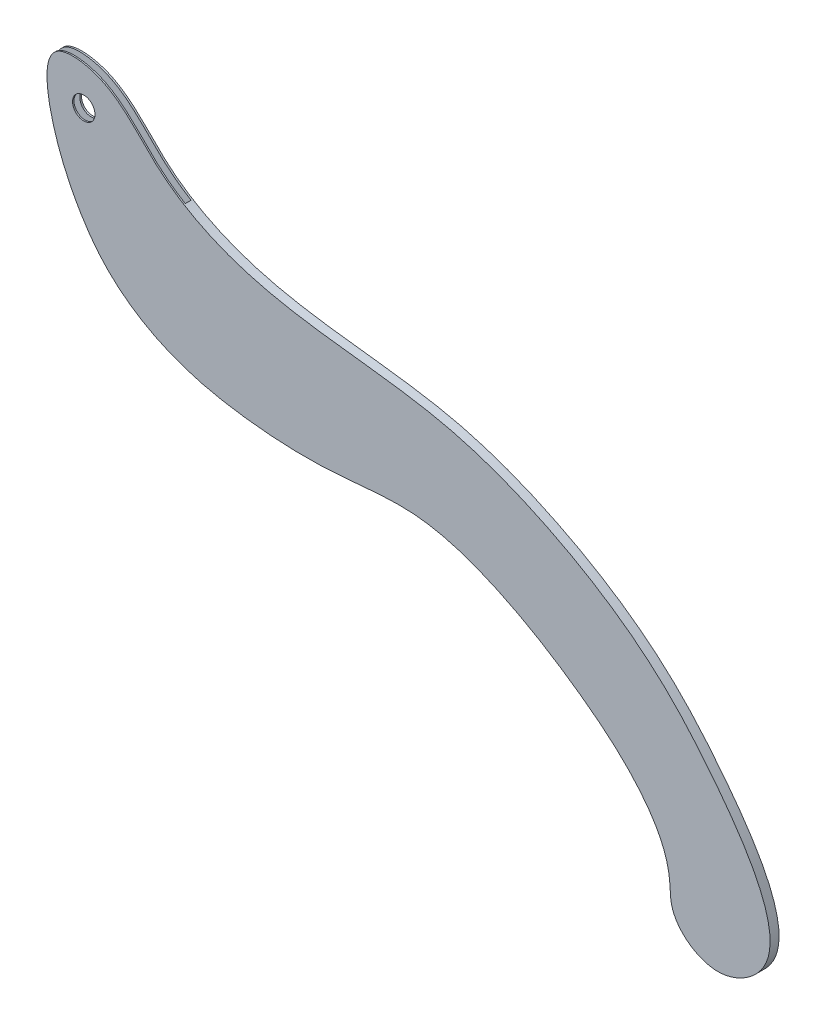
ISO-10303-21;
HEADER;
FILE_DESCRIPTION(('STEP AP214'),'2;1');
FILE_NAME('part.step','',(''),(''),'','','');
FILE_SCHEMA(('AUTOMOTIVE_DESIGN { 1 0 10303 214 1 1 1 1 }'));
ENDSEC;
DATA;
#1=APPLICATION_CONTEXT('core data for automotive mechanical design processes');
#2=APPLICATION_PROTOCOL_DEFINITION('international standard','automotive_design',2000,#1);
#3=PRODUCT_CONTEXT('',#1,'mechanical');
#4=PRODUCT('Part','Part','',(#3));
#5=PRODUCT_RELATED_PRODUCT_CATEGORY('part','',(#4));
#6=PRODUCT_DEFINITION_FORMATION('','',#4);
#7=PRODUCT_DEFINITION_CONTEXT('part definition',#1,'design');
#8=PRODUCT_DEFINITION('design','',#6,#7);
#9=PRODUCT_DEFINITION_SHAPE('','',#8);
#10=(LENGTH_UNIT() NAMED_UNIT(*) SI_UNIT(.MILLI.,.METRE.));
#11=(NAMED_UNIT(*) PLANE_ANGLE_UNIT() SI_UNIT($,.RADIAN.));
#12=(NAMED_UNIT(*) SI_UNIT($,.STERADIAN.) SOLID_ANGLE_UNIT());
#13=UNCERTAINTY_MEASURE_WITH_UNIT(LENGTH_MEASURE(1.E-05),#10,'distance_accuracy_value','');
#14=(GEOMETRIC_REPRESENTATION_CONTEXT(3) GLOBAL_UNCERTAINTY_ASSIGNED_CONTEXT((#13)) GLOBAL_UNIT_ASSIGNED_CONTEXT((#10,
#11,#12)) REPRESENTATION_CONTEXT('',''));
#15=CARTESIAN_POINT('',(0.,0.,0.));
#16=DIRECTION('',(0.,0.,1.));
#17=DIRECTION('',(1.,0.,0.));
#18=AXIS2_PLACEMENT_3D('',#15,#16,#17);
#19=CARTESIAN_POINT('',(48.9705383761986,-196.632633150816,4.));
#20=CARTESIAN_POINT('',(46.1294359622741,-191.077722458857,4.));
#21=CARTESIAN_POINT('',(39.9525836441823,-176.758072199607,4.));
#22=CARTESIAN_POINT('',(33.6888610031762,-143.477892469248,4.));
#23=CARTESIAN_POINT('',(67.8403140469534,-146.195135320534,4.));
#24=CARTESIAN_POINT('',(85.4772484015105,-171.515365001347,4.));
#25=CARTESIAN_POINT('',(122.079358685135,-190.865193630762,4.));
#26=CARTESIAN_POINT('',(167.160837450734,-198.146439632563,4.));
#27=CARTESIAN_POINT('',(215.266659009226,-202.415554545471,4.));
#28=CARTESIAN_POINT('',(261.868187779632,-220.011362635027,4.));
#29=CARTESIAN_POINT('',(304.264292164276,-246.05293437,4.));
#30=CARTESIAN_POINT('',(338.394065372649,-282.852191688708,4.));
#31=CARTESIAN_POINT('',(374.582196884307,-337.48181099856,4.));
#32=CARTESIAN_POINT('',(335.218264256122,-360.031164038544,4.));
#33=CARTESIAN_POINT('',(315.249156453925,-345.250922307646,4.));
#34=CARTESIAN_POINT('',(316.337341026818,-321.73944194135,4.));
#35=CARTESIAN_POINT('',(301.234473932279,-298.450086451868,4.));
#36=CARTESIAN_POINT('',(273.648107308603,-276.251605575409,4.));
#37=CARTESIAN_POINT('',(241.662098869986,-256.4659078873,4.));
#38=CARTESIAN_POINT('',(203.450447797199,-242.796579230254,4.));
#39=CARTESIAN_POINT('',(165.244312325613,-248.993247193019,4.));
#40=CARTESIAN_POINT('',(130.505913053023,-247.652740910726,4.));
#41=CARTESIAN_POINT('',(101.182576508653,-242.276637333363,4.));
#42=CARTESIAN_POINT('',(77.9165206811665,-231.550816902548,4.));
#43=CARTESIAN_POINT('',(60.3596106742014,-216.604802502967,4.));
#44=CARTESIAN_POINT('',(52.2402177951542,-203.025495680029,4.));
#45=CARTESIAN_POINT('',(48.9705383761986,-196.632633150816,4.));
#46=B_SPLINE_CURVE_WITH_KNOTS('',3,(#19,#20,#21,#22,#23,#24,#25,#26,#27,#28,#29,#30,#31,#32,#33,
#34,#35,#36,#37,#38,#39,#40,#41,#42,#43,#44,#45),.UNSPECIFIED.,.T.,.F.,(4,1,1,1,1,1,1,1,1,1,1,1,
1,1,1,1,1,1,1,1,1,1,1,1,4),(0.,0.0234720087692914,0.0623680231052888,0.0806708724138724,
0.12503761903935,0.170921859912321,0.226667161239587,0.290337186813257,0.345340933483174,
0.407144446790264,0.464932087424915,0.544823905466163,0.571391502650128,0.60055857930571,
0.613404414803082,0.654509297563496,0.693964887098304,0.742823607062746,0.790978708634109,
0.836995596035149,0.880905325832766,0.917166554241747,0.944526295846428,0.972987265922426,1.),.UNSPECIFIED.);
#47=DIRECTION('',(0.,0.,-1.));
#48=VECTOR('',#47,1.);
#49=SURFACE_OF_LINEAR_EXTRUSION('',#46,#48);
#50=CARTESIAN_POINT('',(48.9705383761986,-196.632633150816,4.));
#51=VERTEX_POINT('',#50);
#52=EDGE_CURVE('E96',#51,#51,#46,.T.);
#53=ORIENTED_EDGE('',*,*,#52,.T.);
#54=EDGE_LOOP('',(#53));
#55=FACE_BOUND('',#54,.T.);
#56=CARTESIAN_POINT('',(48.9705383761986,-196.632633150816,0.));
#57=CARTESIAN_POINT('',(46.1294359622741,-191.077722458857,0.));
#58=CARTESIAN_POINT('',(39.9525836441823,-176.758072199607,0.));
#59=CARTESIAN_POINT('',(33.6888610031762,-143.477892469248,0.));
#60=CARTESIAN_POINT('',(67.8403140469534,-146.195135320534,0.));
#61=CARTESIAN_POINT('',(85.4772484015105,-171.515365001347,0.));
#62=CARTESIAN_POINT('',(122.079358685135,-190.865193630762,0.));
#63=CARTESIAN_POINT('',(167.160837450734,-198.146439632563,0.));
#64=CARTESIAN_POINT('',(215.266659009226,-202.415554545471,0.));
#65=CARTESIAN_POINT('',(261.868187779632,-220.011362635027,0.));
#66=CARTESIAN_POINT('',(304.264292164276,-246.05293437,0.));
#67=CARTESIAN_POINT('',(338.394065372649,-282.852191688708,0.));
#68=CARTESIAN_POINT('',(374.582196884307,-337.48181099856,0.));
#69=CARTESIAN_POINT('',(335.218264256122,-360.031164038544,0.));
#70=CARTESIAN_POINT('',(315.249156453925,-345.250922307646,0.));
#71=CARTESIAN_POINT('',(316.337341026818,-321.73944194135,0.));
#72=CARTESIAN_POINT('',(301.234473932279,-298.450086451868,0.));
#73=CARTESIAN_POINT('',(273.648107308603,-276.251605575409,0.));
#74=CARTESIAN_POINT('',(241.662098869986,-256.4659078873,0.));
#75=CARTESIAN_POINT('',(203.450447797199,-242.796579230254,0.));
#76=CARTESIAN_POINT('',(165.244312325613,-248.993247193019,0.));
#77=CARTESIAN_POINT('',(130.505913053023,-247.652740910726,0.));
#78=CARTESIAN_POINT('',(101.182576508653,-242.276637333363,0.));
#79=CARTESIAN_POINT('',(77.9165206811665,-231.550816902548,0.));
#80=CARTESIAN_POINT('',(60.3596106742014,-216.604802502967,0.));
#81=CARTESIAN_POINT('',(52.2402177951542,-203.025495680029,0.));
#82=CARTESIAN_POINT('',(48.9705383761986,-196.632633150816,0.));
#83=B_SPLINE_CURVE_WITH_KNOTS('',3,(#56,#57,#58,#59,#60,#61,#62,#63,#64,#65,#66,#67,#68,#69,#70,
#71,#72,#73,#74,#75,#76,#77,#78,#79,#80,#81,#82),.UNSPECIFIED.,.T.,.F.,(4,1,1,1,1,1,1,1,1,1,1,1,
1,1,1,1,1,1,1,1,1,1,1,1,4),(0.,0.0234720087692914,0.0623680231052888,0.0806708724138724,
0.12503761903935,0.170921859912321,0.226667161239587,0.290337186813257,0.345340933483174,
0.407144446790264,0.464932087424915,0.544823905466163,0.571391502650128,0.60055857930571,
0.613404414803082,0.654509297563496,0.693964887098304,0.742823607062746,0.790978708634109,
0.836995596035149,0.880905325832766,0.917166554241747,0.944526295846428,0.972987265922426,1.),.UNSPECIFIED.);
#84=CARTESIAN_POINT('',(48.9705383761986,-196.632633150816,0.));
#85=VERTEX_POINT('',#84);
#86=EDGE_CURVE('E92',#85,#85,#83,.T.);
#87=ORIENTED_EDGE('',*,*,#86,.F.);
#88=EDGE_LOOP('',(#87));
#89=FACE_BOUND('',#88,.T.);
#90=DIRECTION('',(0.,0.,-1.));
#91=VECTOR('',#90,1.);
#92=CARTESIAN_POINT('',(99.,-177.756416724151,4.));
#93=LINE('',#92,#91);
#94=CARTESIAN_POINT('',(99.,-177.756416724151,3.37100349286468));
#95=VERTEX_POINT('',#94);
#96=CARTESIAN_POINT('',(99.,-177.756416724151,0.767801961043632));
#97=VERTEX_POINT('',#96);
#98=EDGE_CURVE('E104',#95,#97,#93,.T.);
#99=ORIENTED_EDGE('',*,*,#98,.F.);
#100=CARTESIAN_POINT('',(48.9705383761986,-196.632633150816,3.37100349286468));
#101=CARTESIAN_POINT('',(46.1294359622741,-191.077722458857,3.37100349286468));
#102=CARTESIAN_POINT('',(39.9525836441823,-176.758072199607,3.37100349286468));
#103=CARTESIAN_POINT('',(33.6888610031762,-143.477892469248,3.37100349286468));
#104=CARTESIAN_POINT('',(67.8403140469534,-146.195135320534,3.37100349286468));
#105=CARTESIAN_POINT('',(85.4772484015105,-171.515365001347,3.37100349286468));
#106=CARTESIAN_POINT('',(122.079358685135,-190.865193630762,3.37100349286468));
#107=CARTESIAN_POINT('',(167.160837450734,-198.146439632563,3.37100349286468));
#108=CARTESIAN_POINT('',(215.266659009226,-202.415554545471,3.37100349286468));
#109=CARTESIAN_POINT('',(261.868187779632,-220.011362635027,3.37100349286468));
#110=CARTESIAN_POINT('',(304.264292164276,-246.05293437,3.37100349286468));
#111=CARTESIAN_POINT('',(338.394065372649,-282.852191688708,3.37100349286468));
#112=CARTESIAN_POINT('',(374.582196884307,-337.48181099856,3.37100349286468));
#113=CARTESIAN_POINT('',(335.218264256122,-360.031164038544,3.37100349286468));
#114=CARTESIAN_POINT('',(315.249156453925,-345.250922307646,3.37100349286468));
#115=CARTESIAN_POINT('',(316.337341026818,-321.73944194135,3.37100349286468));
#116=CARTESIAN_POINT('',(301.234473932279,-298.450086451868,3.37100349286468));
#117=CARTESIAN_POINT('',(273.648107308603,-276.251605575409,3.37100349286468));
#118=CARTESIAN_POINT('',(241.662098869986,-256.4659078873,3.37100349286468));
#119=CARTESIAN_POINT('',(203.450447797199,-242.796579230254,3.37100349286468));
#120=CARTESIAN_POINT('',(165.244312325613,-248.993247193019,3.37100349286468));
#121=CARTESIAN_POINT('',(130.505913053023,-247.652740910726,3.37100349286468));
#122=CARTESIAN_POINT('',(101.182576508653,-242.276637333363,3.37100349286468));
#123=CARTESIAN_POINT('',(77.9165206811665,-231.550816902548,3.37100349286468));
#124=CARTESIAN_POINT('',(60.3596106742014,-216.604802502967,3.37100349286468));
#125=CARTESIAN_POINT('',(52.2402177951542,-203.025495680029,3.37100349286468));
#126=CARTESIAN_POINT('',(48.9705383761986,-196.632633150816,3.37100349286468));
#127=B_SPLINE_CURVE_WITH_KNOTS('',3,(#100,#101,#102,#103,#104,#105,#106,#107,#108,#109,#110,
#111,#112,#113,#114,#115,#116,#117,#118,#119,#120,#121,#122,#123,#124,#125,#126),.UNSPECIFIED.,
.T.,.F.,(4,1,1,1,1,1,1,1,1,1,1,1,1,1,1,1,1,1,1,1,1,1,1,1,4),(0.,0.0234720087692914,
0.0623680231052888,0.0806708724138724,0.12503761903935,0.170921859912321,0.226667161239587,
0.290337186813257,0.345340933483174,0.407144446790264,0.464932087424915,0.544823905466163,
0.571391502650128,0.60055857930571,0.613404414803082,0.654509297563496,0.693964887098304,
0.742823607062746,0.790978708634109,0.836995596035149,0.880905325832766,0.917166554241747,
0.944526295846428,0.972987265922426,1.),.UNSPECIFIED.);
#128=CARTESIAN_POINT('',(55.3416895246689,-207.703694680515,3.37100349286468));
#129=VERTEX_POINT('',#128);
#130=EDGE_CURVE('E11',#95,#129,#127,.F.);
#131=ORIENTED_EDGE('',*,*,#130,.T.);
#132=DIRECTION('',(0.,0.,-1.));
#133=VECTOR('',#132,1.);
#134=CARTESIAN_POINT('',(55.3416895246689,-207.703694680515,4.));
#135=LINE('',#134,#133);
#136=CARTESIAN_POINT('',(55.3416895246699,-207.703694680515,0.767801961043632));
#137=VERTEX_POINT('',#136);
#138=EDGE_CURVE('E53',#129,#137,#135,.T.);
#139=ORIENTED_EDGE('',*,*,#138,.T.);
#140=CARTESIAN_POINT('',(48.9705383761986,-196.632633150816,0.767801961043632));
#141=CARTESIAN_POINT('',(46.1294359622741,-191.077722458857,0.767801961043632));
#142=CARTESIAN_POINT('',(39.9525836441823,-176.758072199607,0.767801961043632));
#143=CARTESIAN_POINT('',(33.6888610031762,-143.477892469248,0.767801961043632));
#144=CARTESIAN_POINT('',(67.8403140469534,-146.195135320534,0.767801961043632));
#145=CARTESIAN_POINT('',(85.4772484015105,-171.515365001347,0.767801961043632));
#146=CARTESIAN_POINT('',(122.079358685135,-190.865193630762,0.767801961043632));
#147=CARTESIAN_POINT('',(167.160837450734,-198.146439632563,0.767801961043632));
#148=CARTESIAN_POINT('',(215.266659009226,-202.415554545471,0.767801961043632));
#149=CARTESIAN_POINT('',(261.868187779632,-220.011362635027,0.767801961043632));
#150=CARTESIAN_POINT('',(304.264292164276,-246.05293437,0.767801961043632));
#151=CARTESIAN_POINT('',(338.394065372649,-282.852191688708,0.767801961043632));
#152=CARTESIAN_POINT('',(374.582196884307,-337.48181099856,0.767801961043632));
#153=CARTESIAN_POINT('',(335.218264256122,-360.031164038544,0.767801961043632));
#154=CARTESIAN_POINT('',(315.249156453925,-345.250922307646,0.767801961043632));
#155=CARTESIAN_POINT('',(316.337341026818,-321.73944194135,0.767801961043632));
#156=CARTESIAN_POINT('',(301.234473932279,-298.450086451868,0.767801961043632));
#157=CARTESIAN_POINT('',(273.648107308603,-276.251605575409,0.767801961043632));
#158=CARTESIAN_POINT('',(241.662098869986,-256.4659078873,0.767801961043632));
#159=CARTESIAN_POINT('',(203.450447797199,-242.796579230254,0.767801961043632));
#160=CARTESIAN_POINT('',(165.244312325613,-248.993247193019,0.767801961043632));
#161=CARTESIAN_POINT('',(130.505913053023,-247.652740910726,0.767801961043632));
#162=CARTESIAN_POINT('',(101.182576508653,-242.276637333363,0.767801961043632));
#163=CARTESIAN_POINT('',(77.9165206811665,-231.550816902548,0.767801961043632));
#164=CARTESIAN_POINT('',(60.3596106742014,-216.604802502967,0.767801961043632));
#165=CARTESIAN_POINT('',(52.2402177951542,-203.025495680029,0.767801961043632));
#166=CARTESIAN_POINT('',(48.9705383761986,-196.632633150816,0.767801961043632));
#167=B_SPLINE_CURVE_WITH_KNOTS('',3,(#140,#141,#142,#143,#144,#145,#146,#147,#148,#149,#150,
#151,#152,#153,#154,#155,#156,#157,#158,#159,#160,#161,#162,#163,#164,#165,#166),.UNSPECIFIED.,
.T.,.F.,(4,1,1,1,1,1,1,1,1,1,1,1,1,1,1,1,1,1,1,1,1,1,1,1,4),(0.,0.0234720087692914,
0.0623680231052888,0.0806708724138724,0.12503761903935,0.170921859912321,0.226667161239587,
0.290337186813257,0.345340933483174,0.407144446790264,0.464932087424915,0.544823905466163,
0.571391502650128,0.60055857930571,0.613404414803082,0.654509297563496,0.693964887098304,
0.742823607062746,0.790978708634109,0.836995596035149,0.880905325832766,0.917166554241747,
0.944526295846428,0.972987265922426,1.),.UNSPECIFIED.);
#168=EDGE_CURVE('E115',#137,#97,#167,.T.);
#169=ORIENTED_EDGE('',*,*,#168,.T.);
#170=EDGE_LOOP('',(#99,#131,#139,#169));
#171=FACE_BOUND('',#170,.T.);
#172=ADVANCED_FACE('F44',(#55,#89,#171),#49,.T.);
#173=CARTESIAN_POINT('',(0.,0.,4.));
#174=DIRECTION('',(0.,0.,1.));
#175=DIRECTION('',(1.,0.,0.));
#176=AXIS2_PLACEMENT_3D('',#173,#174,#175);
#177=PLANE('',#176);
#178=CARTESIAN_POINT('',(54.4452137536882,-162.813204102082,4.));
#179=DIRECTION('',(0.,0.,1.));
#180=DIRECTION('',(1.,0.,0.));
#181=AXIS2_PLACEMENT_3D('',#178,#179,#180);
#182=CIRCLE('',#181,5.);
#183=CARTESIAN_POINT('',(59.4452137536882,-162.813204102082,4.));
#184=VERTEX_POINT('',#183);
#185=EDGE_CURVE('E83',#184,#184,#182,.F.);
#186=ORIENTED_EDGE('',*,*,#185,.T.);
#187=EDGE_LOOP('',(#186));
#188=FACE_BOUND('',#187,.T.);
#189=ORIENTED_EDGE('',*,*,#52,.F.);
#190=EDGE_LOOP('',(#189));
#191=FACE_BOUND('',#190,.T.);
#192=ADVANCED_FACE('F158',(#188,#191),#177,.T.);
#193=CARTESIAN_POINT('',(0.,0.,0.));
#194=DIRECTION('',(0.,0.,1.));
#195=DIRECTION('',(1.,0.,0.));
#196=AXIS2_PLACEMENT_3D('',#193,#194,#195);
#197=PLANE('',#196);
#198=CARTESIAN_POINT('',(54.4452137536882,-162.813204102082,0.));
#199=DIRECTION('',(0.,0.,1.));
#200=DIRECTION('',(1.,0.,0.));
#201=AXIS2_PLACEMENT_3D('',#198,#199,#200);
#202=CIRCLE('',#201,5.);
#203=CARTESIAN_POINT('',(59.4452137536882,-162.813204102082,0.));
#204=VERTEX_POINT('',#203);
#205=EDGE_CURVE('E137',#204,#204,#202,.T.);
#206=ORIENTED_EDGE('',*,*,#205,.T.);
#207=EDGE_LOOP('',(#206));
#208=FACE_BOUND('',#207,.T.);
#209=ORIENTED_EDGE('',*,*,#86,.T.);
#210=EDGE_LOOP('',(#209));
#211=FACE_BOUND('',#210,.T.);
#212=ADVANCED_FACE('F164',(#208,#211),#197,.F.);
#213=CARTESIAN_POINT('',(99.,-142.974828125871,3.37100349286468));
#214=DIRECTION('',(0.,0.,-1.));
#215=DIRECTION('',(-1.,0.,0.));
#216=AXIS2_PLACEMENT_3D('',#213,#214,#215);
#217=PLANE('',#216);
#218=CARTESIAN_POINT('',(54.4452137536882,-162.813204102082,3.37100349286468));
#219=DIRECTION('',(0.,0.,-1.));
#220=DIRECTION('',(-1.,0.,0.));
#221=AXIS2_PLACEMENT_3D('',#218,#219,#220);
#222=CIRCLE('',#221,5.);
#223=CARTESIAN_POINT('',(49.4452137536882,-162.813204102082,3.37100349286468));
#224=VERTEX_POINT('',#223);
#225=EDGE_CURVE('E134',#224,#224,#222,.F.);
#226=ORIENTED_EDGE('',*,*,#225,.T.);
#227=EDGE_LOOP('',(#226));
#228=FACE_BOUND('',#227,.T.);
#229=DIRECTION('',(0.,-1.,0.));
#230=VECTOR('',#229,1.);
#231=CARTESIAN_POINT('',(99.,-142.974828125871,3.37100349286468));
#232=LINE('',#231,#230);
#233=CARTESIAN_POINT('',(99.,-207.703694680515,3.37100349286468));
#234=VERTEX_POINT('',#233);
#235=EDGE_CURVE('E60',#95,#234,#232,.T.);
#236=ORIENTED_EDGE('',*,*,#235,.T.);
#237=DIRECTION('',(-1.,0.,0.));
#238=VECTOR('',#237,1.);
#239=CARTESIAN_POINT('',(99.,-207.703694680515,3.37100349286468));
#240=LINE('',#239,#238);
#241=EDGE_CURVE('E80',#234,#129,#240,.T.);
#242=ORIENTED_EDGE('',*,*,#241,.T.);
#243=ORIENTED_EDGE('',*,*,#130,.F.);
#244=EDGE_LOOP('',(#236,#242,#243));
#245=FACE_BOUND('',#244,.T.);
#246=ADVANCED_FACE('F79',(#228,#245),#217,.T.);
#247=CARTESIAN_POINT('',(99.,-207.703694680515,3.37100349286468));
#248=DIRECTION('',(0.,1.,0.));
#249=DIRECTION('',(0.,0.,1.));
#250=AXIS2_PLACEMENT_3D('',#247,#248,#249);
#251=PLANE('',#250);
#252=ORIENTED_EDGE('',*,*,#241,.F.);
#253=DIRECTION('',(0.,0.,-1.));
#254=VECTOR('',#253,1.);
#255=CARTESIAN_POINT('',(99.,-207.703694680515,3.37100349286468));
#256=LINE('',#255,#254);
#257=CARTESIAN_POINT('',(99.,-207.703694680515,0.767801961043632));
#258=VERTEX_POINT('',#257);
#259=EDGE_CURVE('E82',#234,#258,#256,.T.);
#260=ORIENTED_EDGE('',*,*,#259,.T.);
#261=DIRECTION('',(-1.,0.,0.));
#262=VECTOR('',#261,1.);
#263=CARTESIAN_POINT('',(99.,-207.703694680515,0.767801961043632));
#264=LINE('',#263,#262);
#265=EDGE_CURVE('E93',#258,#137,#264,.T.);
#266=ORIENTED_EDGE('',*,*,#265,.T.);
#267=ORIENTED_EDGE('',*,*,#138,.F.);
#268=EDGE_LOOP('',(#252,#260,#266,#267));
#269=FACE_BOUND('',#268,.T.);
#270=ADVANCED_FACE('F91',(#269),#251,.T.);
#271=CARTESIAN_POINT('',(99.,-142.974828125871,0.767801961043632));
#272=DIRECTION('',(0.,0.,1.));
#273=DIRECTION('',(1.,0.,0.));
#274=AXIS2_PLACEMENT_3D('',#271,#272,#273);
#275=PLANE('',#274);
#276=CARTESIAN_POINT('',(54.4452137536882,-162.813204102082,0.767801961043632));
#277=DIRECTION('',(0.,0.,1.));
#278=DIRECTION('',(1.,0.,0.));
#279=AXIS2_PLACEMENT_3D('',#276,#277,#278);
#280=CIRCLE('',#279,5.);
#281=CARTESIAN_POINT('',(59.4452137536882,-162.813204102082,0.767801961043632));
#282=VERTEX_POINT('',#281);
#283=EDGE_CURVE('E48',#282,#282,#280,.F.);
#284=ORIENTED_EDGE('',*,*,#283,.T.);
#285=EDGE_LOOP('',(#284));
#286=FACE_BOUND('',#285,.T.);
#287=ORIENTED_EDGE('',*,*,#265,.F.);
#288=DIRECTION('',(0.,1.,0.));
#289=VECTOR('',#288,1.);
#290=CARTESIAN_POINT('',(99.,-142.974828125871,0.767801961043632));
#291=LINE('',#290,#289);
#292=EDGE_CURVE('E88',#258,#97,#291,.T.);
#293=ORIENTED_EDGE('',*,*,#292,.T.);
#294=ORIENTED_EDGE('',*,*,#168,.F.);
#295=EDGE_LOOP('',(#287,#293,#294));
#296=FACE_BOUND('',#295,.T.);
#297=ADVANCED_FACE('F130',(#286,#296),#275,.T.);
#298=CARTESIAN_POINT('',(99.,0.,0.));
#299=DIRECTION('',(1.,0.,0.));
#300=DIRECTION('',(0.,0.,-1.));
#301=AXIS2_PLACEMENT_3D('',#298,#299,#300);
#302=PLANE('',#301);
#303=ORIENTED_EDGE('',*,*,#98,.T.);
#304=ORIENTED_EDGE('',*,*,#292,.F.);
#305=ORIENTED_EDGE('',*,*,#259,.F.);
#306=ORIENTED_EDGE('',*,*,#235,.F.);
#307=EDGE_LOOP('',(#303,#304,#305,#306));
#308=FACE_BOUND('',#307,.T.);
#309=ADVANCED_FACE('F86',(#308),#302,.F.);
#310=CARTESIAN_POINT('',(54.4452137536882,-162.813204102082,99.));
#311=DIRECTION('',(0.,0.,-1.));
#312=DIRECTION('',(-1.,0.,0.));
#313=AXIS2_PLACEMENT_3D('',#310,#311,#312);
#314=CYLINDRICAL_SURFACE('',#313,5.);
#315=ORIENTED_EDGE('',*,*,#283,.F.);
#316=EDGE_LOOP('',(#315));
#317=FACE_BOUND('',#316,.T.);
#318=ORIENTED_EDGE('',*,*,#205,.F.);
#319=EDGE_LOOP('',(#318));
#320=FACE_BOUND('',#319,.T.);
#321=ADVANCED_FACE('F145',(#317,#320),#314,.F.);
#322=ORIENTED_EDGE('',*,*,#185,.F.);
#323=EDGE_LOOP('',(#322));
#324=FACE_BOUND('',#323,.T.);
#325=ORIENTED_EDGE('',*,*,#225,.F.);
#326=EDGE_LOOP('',(#325));
#327=FACE_BOUND('',#326,.T.);
#328=ADVANCED_FACE('F148',(#324,#327),#314,.F.);
#329=CLOSED_SHELL('',(#172,#192,#212,#246,#270,#297,#309,#321,#328));
#330=MANIFOLD_SOLID_BREP('B2',#329);
#331=ADVANCED_BREP_SHAPE_REPRESENTATION('',(#18,#330),#14);
#332=SHAPE_DEFINITION_REPRESENTATION(#9,#331);
ENDSEC;
END-ISO-10303-21;
